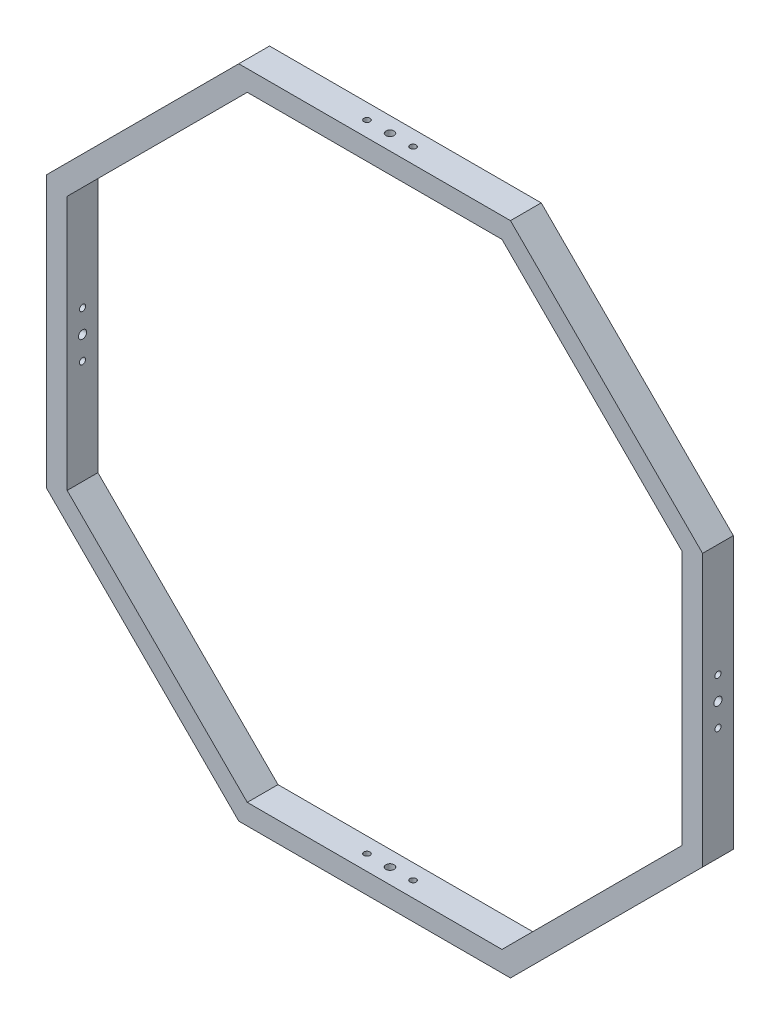
ISO-10303-21;
HEADER;
FILE_DESCRIPTION(('STEP AP214'),'2;1');
FILE_NAME('part.step','',(''),(''),'','','');
FILE_SCHEMA(('AUTOMOTIVE_DESIGN { 1 0 10303 214 1 1 1 1 }'));
ENDSEC;
DATA;
#1=APPLICATION_CONTEXT('core data for automotive mechanical design processes');
#2=APPLICATION_PROTOCOL_DEFINITION('international standard','automotive_design',2000,#1);
#3=PRODUCT_CONTEXT('',#1,'mechanical');
#4=PRODUCT('Part','Part','',(#3));
#5=PRODUCT_RELATED_PRODUCT_CATEGORY('part','',(#4));
#6=PRODUCT_DEFINITION_FORMATION('','',#4);
#7=PRODUCT_DEFINITION_CONTEXT('part definition',#1,'design');
#8=PRODUCT_DEFINITION('design','',#6,#7);
#9=PRODUCT_DEFINITION_SHAPE('','',#8);
#10=(LENGTH_UNIT() NAMED_UNIT(*) SI_UNIT(.MILLI.,.METRE.));
#11=(NAMED_UNIT(*) PLANE_ANGLE_UNIT() SI_UNIT($,.RADIAN.));
#12=(NAMED_UNIT(*) SI_UNIT($,.STERADIAN.) SOLID_ANGLE_UNIT());
#13=UNCERTAINTY_MEASURE_WITH_UNIT(LENGTH_MEASURE(1.E-05),#10,'distance_accuracy_value','');
#14=(GEOMETRIC_REPRESENTATION_CONTEXT(3) GLOBAL_UNCERTAINTY_ASSIGNED_CONTEXT((#13)) GLOBAL_UNIT_ASSIGNED_CONTEXT((#10,
#11,#12)) REPRESENTATION_CONTEXT('',''));
#15=CARTESIAN_POINT('',(0.,0.,0.));
#16=DIRECTION('',(0.,0.,1.));
#17=DIRECTION('',(1.,0.,0.));
#18=AXIS2_PLACEMENT_3D('',#15,#16,#17);
#19=CARTESIAN_POINT('',(0.,0.,60.));
#20=DIRECTION('',(0.,0.,1.));
#21=DIRECTION('',(1.,0.,0.));
#22=AXIS2_PLACEMENT_3D('',#19,#20,#21);
#23=PLANE('',#22);
#24=DIRECTION('',(-0.707106781186548,0.707106781186547,0.));
#25=VECTOR('',#24,1.);
#26=CARTESIAN_POINT('',(640.,265.096679918781,60.));
#27=LINE('',#26,#25);
#28=CARTESIAN_POINT('',(640.,265.096679918781,60.));
#29=VERTEX_POINT('',#28);
#30=CARTESIAN_POINT('',(265.09667991878,640.,60.));
#31=VERTEX_POINT('',#30);
#32=EDGE_CURVE('E220',#29,#31,#27,.T.);
#33=ORIENTED_EDGE('',*,*,#32,.T.);
#34=DIRECTION('',(-1.,0.,0.));
#35=VECTOR('',#34,1.);
#36=CARTESIAN_POINT('',(265.09667991878,640.,60.));
#37=LINE('',#36,#35);
#38=CARTESIAN_POINT('',(-265.096679918781,640.,60.));
#39=VERTEX_POINT('',#38);
#40=EDGE_CURVE('E223',#31,#39,#37,.T.);
#41=ORIENTED_EDGE('',*,*,#40,.T.);
#42=DIRECTION('',(-0.707106781186547,-0.707106781186548,0.));
#43=VECTOR('',#42,1.);
#44=CARTESIAN_POINT('',(-265.096679918781,640.,60.));
#45=LINE('',#44,#43);
#46=CARTESIAN_POINT('',(-640.,265.096679918781,60.));
#47=VERTEX_POINT('',#46);
#48=EDGE_CURVE('E226',#39,#47,#45,.T.);
#49=ORIENTED_EDGE('',*,*,#48,.T.);
#50=DIRECTION('',(0.,-1.,0.));
#51=VECTOR('',#50,1.);
#52=CARTESIAN_POINT('',(-640.,265.096679918781,60.));
#53=LINE('',#52,#51);
#54=CARTESIAN_POINT('',(-640.,-265.096679918781,60.));
#55=VERTEX_POINT('',#54);
#56=EDGE_CURVE('E228',#47,#55,#53,.T.);
#57=ORIENTED_EDGE('',*,*,#56,.T.);
#58=DIRECTION('',(0.707106781186548,-0.707106781186547,0.));
#59=VECTOR('',#58,1.);
#60=CARTESIAN_POINT('',(-640.,-265.096679918781,60.));
#61=LINE('',#60,#59);
#62=CARTESIAN_POINT('',(-265.096679918781,-640.,60.));
#63=VERTEX_POINT('',#62);
#64=EDGE_CURVE('E230',#55,#63,#61,.T.);
#65=ORIENTED_EDGE('',*,*,#64,.T.);
#66=DIRECTION('',(1.,0.,0.));
#67=VECTOR('',#66,1.);
#68=CARTESIAN_POINT('',(-265.096679918781,-640.,60.));
#69=LINE('',#68,#67);
#70=CARTESIAN_POINT('',(265.096679918781,-640.,60.));
#71=VERTEX_POINT('',#70);
#72=EDGE_CURVE('E232',#63,#71,#69,.T.);
#73=ORIENTED_EDGE('',*,*,#72,.T.);
#74=DIRECTION('',(0.707106781186547,0.707106781186548,0.));
#75=VECTOR('',#74,1.);
#76=CARTESIAN_POINT('',(265.096679918781,-640.,60.));
#77=LINE('',#76,#75);
#78=CARTESIAN_POINT('',(640.,-265.096679918781,60.));
#79=VERTEX_POINT('',#78);
#80=EDGE_CURVE('E234',#71,#79,#77,.T.);
#81=ORIENTED_EDGE('',*,*,#80,.T.);
#82=DIRECTION('',(0.,1.,0.));
#83=VECTOR('',#82,1.);
#84=CARTESIAN_POINT('',(640.,-265.096679918781,60.));
#85=LINE('',#84,#83);
#86=EDGE_CURVE('E236',#79,#29,#85,.T.);
#87=ORIENTED_EDGE('',*,*,#86,.T.);
#88=EDGE_LOOP('',(#33,#41,#49,#57,#65,#73,#81,#87));
#89=FACE_BOUND('',#88,.T.);
#90=DIRECTION('',(0.,1.,0.));
#91=VECTOR('',#90,1.);
#92=CARTESIAN_POINT('',(600.,-248.528137423857,60.));
#93=LINE('',#92,#91);
#94=CARTESIAN_POINT('',(600.,-248.528137423857,60.));
#95=VERTEX_POINT('',#94);
#96=CARTESIAN_POINT('',(600.,248.528137423857,60.));
#97=VERTEX_POINT('',#96);
#98=EDGE_CURVE('E161',#95,#97,#93,.T.);
#99=ORIENTED_EDGE('',*,*,#98,.F.);
#100=DIRECTION('',(0.707106781186547,0.707106781186548,0.));
#101=VECTOR('',#100,1.);
#102=CARTESIAN_POINT('',(248.528137423857,-600.,60.));
#103=LINE('',#102,#101);
#104=CARTESIAN_POINT('',(248.528137423857,-600.,60.));
#105=VERTEX_POINT('',#104);
#106=EDGE_CURVE('E153',#105,#95,#103,.T.);
#107=ORIENTED_EDGE('',*,*,#106,.F.);
#108=DIRECTION('',(1.,0.,0.));
#109=VECTOR('',#108,1.);
#110=CARTESIAN_POINT('',(-248.528137423857,-600.,60.));
#111=LINE('',#110,#109);
#112=CARTESIAN_POINT('',(-248.528137423857,-600.,60.));
#113=VERTEX_POINT('',#112);
#114=EDGE_CURVE('E187',#113,#105,#111,.T.);
#115=ORIENTED_EDGE('',*,*,#114,.F.);
#116=DIRECTION('',(0.707106781186548,-0.707106781186547,0.));
#117=VECTOR('',#116,1.);
#118=CARTESIAN_POINT('',(-600.,-248.528137423857,60.));
#119=LINE('',#118,#117);
#120=CARTESIAN_POINT('',(-600.,-248.528137423857,60.));
#121=VERTEX_POINT('',#120);
#122=EDGE_CURVE('E185',#121,#113,#119,.T.);
#123=ORIENTED_EDGE('',*,*,#122,.F.);
#124=DIRECTION('',(0.,-1.,0.));
#125=VECTOR('',#124,1.);
#126=CARTESIAN_POINT('',(-600.,248.528137423857,60.));
#127=LINE('',#126,#125);
#128=CARTESIAN_POINT('',(-600.,248.528137423857,60.));
#129=VERTEX_POINT('',#128);
#130=EDGE_CURVE('E183',#129,#121,#127,.T.);
#131=ORIENTED_EDGE('',*,*,#130,.F.);
#132=DIRECTION('',(-0.707106781186547,-0.707106781186548,0.));
#133=VECTOR('',#132,1.);
#134=CARTESIAN_POINT('',(-248.528137423857,600.,60.));
#135=LINE('',#134,#133);
#136=CARTESIAN_POINT('',(-248.528137423857,600.,60.));
#137=VERTEX_POINT('',#136);
#138=EDGE_CURVE('E181',#137,#129,#135,.T.);
#139=ORIENTED_EDGE('',*,*,#138,.F.);
#140=DIRECTION('',(-1.,0.,0.));
#141=VECTOR('',#140,1.);
#142=CARTESIAN_POINT('',(248.528137423856,600.,60.));
#143=LINE('',#142,#141);
#144=CARTESIAN_POINT('',(248.528137423856,600.,60.));
#145=VERTEX_POINT('',#144);
#146=EDGE_CURVE('E176',#145,#137,#143,.T.);
#147=ORIENTED_EDGE('',*,*,#146,.F.);
#148=DIRECTION('',(-0.707106781186548,0.707106781186547,0.));
#149=VECTOR('',#148,1.);
#150=CARTESIAN_POINT('',(600.,248.528137423857,60.));
#151=LINE('',#150,#149);
#152=EDGE_CURVE('E174',#97,#145,#151,.T.);
#153=ORIENTED_EDGE('',*,*,#152,.F.);
#154=EDGE_LOOP('',(#99,#107,#115,#123,#131,#139,#147,#153));
#155=FACE_BOUND('',#154,.T.);
#156=ADVANCED_FACE('F38',(#89,#155),#23,.T.);
#157=CARTESIAN_POINT('',(0.,0.,0.));
#158=DIRECTION('',(0.,0.,1.));
#159=DIRECTION('',(1.,0.,0.));
#160=AXIS2_PLACEMENT_3D('',#157,#158,#159);
#161=PLANE('',#160);
#162=DIRECTION('',(-0.707106781186548,0.707106781186547,0.));
#163=VECTOR('',#162,1.);
#164=CARTESIAN_POINT('',(640.,265.096679918781,0.));
#165=LINE('',#164,#163);
#166=CARTESIAN_POINT('',(640.,265.096679918781,0.));
#167=VERTEX_POINT('',#166);
#168=CARTESIAN_POINT('',(265.09667991878,640.,0.));
#169=VERTEX_POINT('',#168);
#170=EDGE_CURVE('E169',#167,#169,#165,.T.);
#171=ORIENTED_EDGE('',*,*,#170,.F.);
#172=DIRECTION('',(0.,1.,0.));
#173=VECTOR('',#172,1.);
#174=CARTESIAN_POINT('',(640.,-265.096679918781,0.));
#175=LINE('',#174,#173);
#176=CARTESIAN_POINT('',(640.,-265.096679918781,0.));
#177=VERTEX_POINT('',#176);
#178=EDGE_CURVE('E224',#177,#167,#175,.T.);
#179=ORIENTED_EDGE('',*,*,#178,.F.);
#180=DIRECTION('',(0.707106781186547,0.707106781186548,0.));
#181=VECTOR('',#180,1.);
#182=CARTESIAN_POINT('',(265.096679918781,-640.,0.));
#183=LINE('',#182,#181);
#184=CARTESIAN_POINT('',(265.096679918781,-640.,0.));
#185=VERTEX_POINT('',#184);
#186=EDGE_CURVE('E251',#185,#177,#183,.T.);
#187=ORIENTED_EDGE('',*,*,#186,.F.);
#188=DIRECTION('',(1.,0.,0.));
#189=VECTOR('',#188,1.);
#190=CARTESIAN_POINT('',(-265.096679918781,-640.,0.));
#191=LINE('',#190,#189);
#192=CARTESIAN_POINT('',(-265.096679918781,-640.,0.));
#193=VERTEX_POINT('',#192);
#194=EDGE_CURVE('E249',#193,#185,#191,.T.);
#195=ORIENTED_EDGE('',*,*,#194,.F.);
#196=DIRECTION('',(0.707106781186548,-0.707106781186547,0.));
#197=VECTOR('',#196,1.);
#198=CARTESIAN_POINT('',(-640.,-265.096679918781,0.));
#199=LINE('',#198,#197);
#200=CARTESIAN_POINT('',(-640.,-265.096679918781,0.));
#201=VERTEX_POINT('',#200);
#202=EDGE_CURVE('E247',#201,#193,#199,.T.);
#203=ORIENTED_EDGE('',*,*,#202,.F.);
#204=DIRECTION('',(0.,-1.,0.));
#205=VECTOR('',#204,1.);
#206=CARTESIAN_POINT('',(-640.,265.096679918781,0.));
#207=LINE('',#206,#205);
#208=CARTESIAN_POINT('',(-640.,265.096679918781,0.));
#209=VERTEX_POINT('',#208);
#210=EDGE_CURVE('E245',#209,#201,#207,.T.);
#211=ORIENTED_EDGE('',*,*,#210,.F.);
#212=DIRECTION('',(-0.707106781186547,-0.707106781186548,0.));
#213=VECTOR('',#212,1.);
#214=CARTESIAN_POINT('',(-265.096679918781,640.,0.));
#215=LINE('',#214,#213);
#216=CARTESIAN_POINT('',(-265.096679918781,640.,0.));
#217=VERTEX_POINT('',#216);
#218=EDGE_CURVE('E243',#217,#209,#215,.T.);
#219=ORIENTED_EDGE('',*,*,#218,.F.);
#220=DIRECTION('',(-1.,0.,0.));
#221=VECTOR('',#220,1.);
#222=CARTESIAN_POINT('',(265.09667991878,640.,0.));
#223=LINE('',#222,#221);
#224=EDGE_CURVE('E241',#169,#217,#223,.T.);
#225=ORIENTED_EDGE('',*,*,#224,.F.);
#226=EDGE_LOOP('',(#171,#179,#187,#195,#203,#211,#219,#225));
#227=FACE_BOUND('',#226,.T.);
#228=DIRECTION('',(0.707106781186547,0.707106781186548,0.));
#229=VECTOR('',#228,1.);
#230=CARTESIAN_POINT('',(248.528137423857,-600.,0.));
#231=LINE('',#230,#229);
#232=CARTESIAN_POINT('',(248.528137423857,-600.,0.));
#233=VERTEX_POINT('',#232);
#234=CARTESIAN_POINT('',(600.,-248.528137423857,0.));
#235=VERTEX_POINT('',#234);
#236=EDGE_CURVE('E63',#233,#235,#231,.T.);
#237=ORIENTED_EDGE('',*,*,#236,.T.);
#238=DIRECTION('',(0.,1.,0.));
#239=VECTOR('',#238,1.);
#240=CARTESIAN_POINT('',(600.,-248.528137423857,0.));
#241=LINE('',#240,#239);
#242=CARTESIAN_POINT('',(600.,248.528137423857,0.));
#243=VERTEX_POINT('',#242);
#244=EDGE_CURVE('E168',#235,#243,#241,.T.);
#245=ORIENTED_EDGE('',*,*,#244,.T.);
#246=DIRECTION('',(-0.707106781186548,0.707106781186547,0.));
#247=VECTOR('',#246,1.);
#248=CARTESIAN_POINT('',(600.,248.528137423857,0.));
#249=LINE('',#248,#247);
#250=CARTESIAN_POINT('',(248.528137423856,600.,0.));
#251=VERTEX_POINT('',#250);
#252=EDGE_CURVE('E192',#243,#251,#249,.T.);
#253=ORIENTED_EDGE('',*,*,#252,.T.);
#254=DIRECTION('',(-1.,0.,0.));
#255=VECTOR('',#254,1.);
#256=CARTESIAN_POINT('',(248.528137423856,600.,0.));
#257=LINE('',#256,#255);
#258=CARTESIAN_POINT('',(-248.528137423857,600.,0.));
#259=VERTEX_POINT('',#258);
#260=EDGE_CURVE('E195',#251,#259,#257,.T.);
#261=ORIENTED_EDGE('',*,*,#260,.T.);
#262=DIRECTION('',(-0.707106781186547,-0.707106781186548,0.));
#263=VECTOR('',#262,1.);
#264=CARTESIAN_POINT('',(-248.528137423857,600.,0.));
#265=LINE('',#264,#263);
#266=CARTESIAN_POINT('',(-600.,248.528137423857,0.));
#267=VERTEX_POINT('',#266);
#268=EDGE_CURVE('E198',#259,#267,#265,.T.);
#269=ORIENTED_EDGE('',*,*,#268,.T.);
#270=DIRECTION('',(0.,-1.,0.));
#271=VECTOR('',#270,1.);
#272=CARTESIAN_POINT('',(-600.,248.528137423857,0.));
#273=LINE('',#272,#271);
#274=CARTESIAN_POINT('',(-600.,-248.528137423857,0.));
#275=VERTEX_POINT('',#274);
#276=EDGE_CURVE('E201',#267,#275,#273,.T.);
#277=ORIENTED_EDGE('',*,*,#276,.T.);
#278=DIRECTION('',(0.707106781186548,-0.707106781186547,0.));
#279=VECTOR('',#278,1.);
#280=CARTESIAN_POINT('',(-600.,-248.528137423857,0.));
#281=LINE('',#280,#279);
#282=CARTESIAN_POINT('',(-248.528137423857,-600.,0.));
#283=VERTEX_POINT('',#282);
#284=EDGE_CURVE('E204',#275,#283,#281,.T.);
#285=ORIENTED_EDGE('',*,*,#284,.T.);
#286=DIRECTION('',(1.,0.,0.));
#287=VECTOR('',#286,1.);
#288=CARTESIAN_POINT('',(-248.528137423857,-600.,0.));
#289=LINE('',#288,#287);
#290=EDGE_CURVE('E162',#283,#233,#289,.T.);
#291=ORIENTED_EDGE('',*,*,#290,.T.);
#292=EDGE_LOOP('',(#237,#245,#253,#261,#269,#277,#285,#291));
#293=FACE_BOUND('',#292,.T.);
#294=ADVANCED_FACE('F361',(#227,#293),#161,.F.);
#295=CARTESIAN_POINT('',(640.,265.096679918781,60.));
#296=DIRECTION('',(-0.707106781186547,-0.707106781186548,0.));
#297=DIRECTION('',(0.707106781186548,-0.707106781186547,0.));
#298=AXIS2_PLACEMENT_3D('',#295,#296,#297);
#299=PLANE('',#298);
#300=ORIENTED_EDGE('',*,*,#170,.T.);
#301=DIRECTION('',(0.,0.,-1.));
#302=VECTOR('',#301,1.);
#303=CARTESIAN_POINT('',(265.09667991878,640.,60.));
#304=LINE('',#303,#302);
#305=EDGE_CURVE('E11',#31,#169,#304,.T.);
#306=ORIENTED_EDGE('',*,*,#305,.F.);
#307=ORIENTED_EDGE('',*,*,#32,.F.);
#308=DIRECTION('',(0.,0.,-1.));
#309=VECTOR('',#308,1.);
#310=CARTESIAN_POINT('',(640.,265.096679918781,60.));
#311=LINE('',#310,#309);
#312=EDGE_CURVE('E238',#29,#167,#311,.T.);
#313=ORIENTED_EDGE('',*,*,#312,.T.);
#314=EDGE_LOOP('',(#300,#306,#307,#313));
#315=FACE_BOUND('',#314,.T.);
#316=ADVANCED_FACE('F40',(#315),#299,.F.);
#317=CARTESIAN_POINT('',(265.09667991878,640.,60.));
#318=DIRECTION('',(0.,-1.,0.));
#319=DIRECTION('',(1.,0.,0.));
#320=AXIS2_PLACEMENT_3D('',#317,#318,#319);
#321=PLANE('',#320);
#322=CARTESIAN_POINT('',(45.0000000000001,640.,30.));
#323=DIRECTION('',(0.,-1.,0.));
#324=DIRECTION('',(1.,0.,0.));
#325=AXIS2_PLACEMENT_3D('',#322,#323,#324);
#326=CIRCLE('',#325,6.00000000000002);
#327=CARTESIAN_POINT('',(51.0000000000002,640.,30.));
#328=VERTEX_POINT('',#327);
#329=EDGE_CURVE('E314',#328,#328,#326,.T.);
#330=ORIENTED_EDGE('',*,*,#329,.T.);
#331=EDGE_LOOP('',(#330));
#332=FACE_BOUND('',#331,.T.);
#333=CARTESIAN_POINT('',(-44.9999999999999,640.,30.));
#334=DIRECTION('',(0.,-1.,0.));
#335=DIRECTION('',(1.,0.,0.));
#336=AXIS2_PLACEMENT_3D('',#333,#334,#335);
#337=CIRCLE('',#336,5.99999999999999);
#338=CARTESIAN_POINT('',(-38.9999999999999,640.,30.));
#339=VERTEX_POINT('',#338);
#340=EDGE_CURVE('E299',#339,#339,#337,.T.);
#341=ORIENTED_EDGE('',*,*,#340,.T.);
#342=EDGE_LOOP('',(#341));
#343=FACE_BOUND('',#342,.T.);
#344=CARTESIAN_POINT('',(1.38777878078145E-13,640.,30.));
#345=DIRECTION('',(0.,-1.,0.));
#346=DIRECTION('',(1.,0.,0.));
#347=AXIS2_PLACEMENT_3D('',#344,#345,#346);
#348=CIRCLE('',#347,8.);
#349=CARTESIAN_POINT('',(8.00000000000014,640.,30.));
#350=VERTEX_POINT('',#349);
#351=EDGE_CURVE('E295',#350,#350,#348,.T.);
#352=ORIENTED_EDGE('',*,*,#351,.T.);
#353=EDGE_LOOP('',(#352));
#354=FACE_BOUND('',#353,.T.);
#355=ORIENTED_EDGE('',*,*,#224,.T.);
#356=DIRECTION('',(0.,0.,-1.));
#357=VECTOR('',#356,1.);
#358=CARTESIAN_POINT('',(-265.096679918781,640.,60.));
#359=LINE('',#358,#357);
#360=EDGE_CURVE('E47',#39,#217,#359,.T.);
#361=ORIENTED_EDGE('',*,*,#360,.F.);
#362=ORIENTED_EDGE('',*,*,#40,.F.);
#363=ORIENTED_EDGE('',*,*,#305,.T.);
#364=EDGE_LOOP('',(#355,#361,#362,#363));
#365=FACE_BOUND('',#364,.T.);
#366=ADVANCED_FACE('F392',(#332,#343,#354,#365),#321,.F.);
#367=CARTESIAN_POINT('',(-265.096679918781,640.,60.));
#368=DIRECTION('',(0.707106781186548,-0.707106781186547,0.));
#369=DIRECTION('',(0.707106781186547,0.707106781186548,0.));
#370=AXIS2_PLACEMENT_3D('',#367,#368,#369);
#371=PLANE('',#370);
#372=ORIENTED_EDGE('',*,*,#218,.T.);
#373=DIRECTION('',(0.,0.,-1.));
#374=VECTOR('',#373,1.);
#375=CARTESIAN_POINT('',(-640.,265.096679918781,60.));
#376=LINE('',#375,#374);
#377=EDGE_CURVE('E268',#47,#209,#376,.T.);
#378=ORIENTED_EDGE('',*,*,#377,.F.);
#379=ORIENTED_EDGE('',*,*,#48,.F.);
#380=ORIENTED_EDGE('',*,*,#360,.T.);
#381=EDGE_LOOP('',(#372,#378,#379,#380));
#382=FACE_BOUND('',#381,.T.);
#383=ADVANCED_FACE('F390',(#382),#371,.F.);
#384=CARTESIAN_POINT('',(-640.,265.096679918781,60.));
#385=DIRECTION('',(1.,0.,0.));
#386=DIRECTION('',(0.,0.,-1.));
#387=AXIS2_PLACEMENT_3D('',#384,#385,#386);
#388=PLANE('',#387);
#389=CARTESIAN_POINT('',(-640.,-44.9999999999999,30.));
#390=DIRECTION('',(1.,0.,0.));
#391=DIRECTION('',(0.,0.,-1.));
#392=AXIS2_PLACEMENT_3D('',#389,#390,#391);
#393=CIRCLE('',#392,6.00000000000001);
#394=CARTESIAN_POINT('',(-640.,-44.9999999999999,24.));
#395=VERTEX_POINT('',#394);
#396=EDGE_CURVE('E190',#395,#395,#393,.T.);
#397=ORIENTED_EDGE('',*,*,#396,.T.);
#398=EDGE_LOOP('',(#397));
#399=FACE_BOUND('',#398,.T.);
#400=CARTESIAN_POINT('',(-640.,45.0000000000001,30.));
#401=DIRECTION('',(1.,0.,0.));
#402=DIRECTION('',(0.,0.,-1.));
#403=AXIS2_PLACEMENT_3D('',#400,#401,#402);
#404=CIRCLE('',#403,6.00000000000001);
#405=CARTESIAN_POINT('',(-640.,45.0000000000001,24.));
#406=VERTEX_POINT('',#405);
#407=EDGE_CURVE('E287',#406,#406,#404,.T.);
#408=ORIENTED_EDGE('',*,*,#407,.T.);
#409=EDGE_LOOP('',(#408));
#410=FACE_BOUND('',#409,.T.);
#411=CARTESIAN_POINT('',(-640.,1.34015774165447E-13,30.));
#412=DIRECTION('',(1.,0.,0.));
#413=DIRECTION('',(0.,0.,-1.));
#414=AXIS2_PLACEMENT_3D('',#411,#412,#413);
#415=CIRCLE('',#414,8.);
#416=CARTESIAN_POINT('',(-640.,1.34015774165447E-13,22.));
#417=VERTEX_POINT('',#416);
#418=EDGE_CURVE('E282',#417,#417,#415,.T.);
#419=ORIENTED_EDGE('',*,*,#418,.T.);
#420=EDGE_LOOP('',(#419));
#421=FACE_BOUND('',#420,.T.);
#422=ORIENTED_EDGE('',*,*,#210,.T.);
#423=DIRECTION('',(0.,0.,-1.));
#424=VECTOR('',#423,1.);
#425=CARTESIAN_POINT('',(-640.,-265.096679918781,60.));
#426=LINE('',#425,#424);
#427=EDGE_CURVE('E265',#55,#201,#426,.T.);
#428=ORIENTED_EDGE('',*,*,#427,.F.);
#429=ORIENTED_EDGE('',*,*,#56,.F.);
#430=ORIENTED_EDGE('',*,*,#377,.T.);
#431=EDGE_LOOP('',(#422,#428,#429,#430));
#432=FACE_BOUND('',#431,.T.);
#433=ADVANCED_FACE('F337',(#399,#410,#421,#432),#388,.F.);
#434=CARTESIAN_POINT('',(-640.,-265.096679918781,60.));
#435=DIRECTION('',(0.707106781186547,0.707106781186548,0.));
#436=DIRECTION('',(-0.707106781186548,0.707106781186547,0.));
#437=AXIS2_PLACEMENT_3D('',#434,#435,#436);
#438=PLANE('',#437);
#439=ORIENTED_EDGE('',*,*,#202,.T.);
#440=DIRECTION('',(0.,0.,-1.));
#441=VECTOR('',#440,1.);
#442=CARTESIAN_POINT('',(-265.096679918781,-640.,60.));
#443=LINE('',#442,#441);
#444=EDGE_CURVE('E262',#63,#193,#443,.T.);
#445=ORIENTED_EDGE('',*,*,#444,.F.);
#446=ORIENTED_EDGE('',*,*,#64,.F.);
#447=ORIENTED_EDGE('',*,*,#427,.T.);
#448=EDGE_LOOP('',(#439,#445,#446,#447));
#449=FACE_BOUND('',#448,.T.);
#450=ADVANCED_FACE('F383',(#449),#438,.F.);
#451=CARTESIAN_POINT('',(-265.096679918781,-640.,60.));
#452=DIRECTION('',(0.,1.,0.));
#453=DIRECTION('',(0.,0.,1.));
#454=AXIS2_PLACEMENT_3D('',#451,#452,#453);
#455=PLANE('',#454);
#456=CARTESIAN_POINT('',(45.0000000000001,-640.,30.));
#457=DIRECTION('',(0.,-1.,0.));
#458=DIRECTION('',(0.,0.,-1.));
#459=AXIS2_PLACEMENT_3D('',#456,#457,#458);
#460=CIRCLE('',#459,6.00000000000002);
#461=CARTESIAN_POINT('',(45.0000000000001,-640.,24.));
#462=VERTEX_POINT('',#461);
#463=EDGE_CURVE('E586',#462,#462,#460,.T.);
#464=ORIENTED_EDGE('',*,*,#463,.F.);
#465=EDGE_LOOP('',(#464));
#466=FACE_BOUND('',#465,.T.);
#467=CARTESIAN_POINT('',(-44.9999999999999,-640.,30.));
#468=DIRECTION('',(0.,-1.,0.));
#469=DIRECTION('',(0.,0.,-1.));
#470=AXIS2_PLACEMENT_3D('',#467,#468,#469);
#471=CIRCLE('',#470,5.99999999999999);
#472=CARTESIAN_POINT('',(-44.9999999999999,-640.,24.));
#473=VERTEX_POINT('',#472);
#474=EDGE_CURVE('E587',#473,#473,#471,.T.);
#475=ORIENTED_EDGE('',*,*,#474,.F.);
#476=EDGE_LOOP('',(#475));
#477=FACE_BOUND('',#476,.T.);
#478=CARTESIAN_POINT('',(1.38777878078145E-13,-640.,30.));
#479=DIRECTION('',(0.,-1.,0.));
#480=DIRECTION('',(0.,0.,-1.));
#481=AXIS2_PLACEMENT_3D('',#478,#479,#480);
#482=CIRCLE('',#481,8.);
#483=CARTESIAN_POINT('',(1.38777878078145E-13,-640.,22.));
#484=VERTEX_POINT('',#483);
#485=EDGE_CURVE('E291',#484,#484,#482,.T.);
#486=ORIENTED_EDGE('',*,*,#485,.F.);
#487=EDGE_LOOP('',(#486));
#488=FACE_BOUND('',#487,.T.);
#489=ORIENTED_EDGE('',*,*,#194,.T.);
#490=DIRECTION('',(0.,0.,-1.));
#491=VECTOR('',#490,1.);
#492=CARTESIAN_POINT('',(265.096679918781,-640.,60.));
#493=LINE('',#492,#491);
#494=EDGE_CURVE('E259',#71,#185,#493,.T.);
#495=ORIENTED_EDGE('',*,*,#494,.F.);
#496=ORIENTED_EDGE('',*,*,#72,.F.);
#497=ORIENTED_EDGE('',*,*,#444,.T.);
#498=EDGE_LOOP('',(#489,#495,#496,#497));
#499=FACE_BOUND('',#498,.T.);
#500=ADVANCED_FACE('F379',(#466,#477,#488,#499),#455,.F.);
#501=CARTESIAN_POINT('',(265.096679918781,-640.,60.));
#502=DIRECTION('',(-0.707106781186548,0.707106781186547,0.));
#503=DIRECTION('',(-0.707106781186547,-0.707106781186548,0.));
#504=AXIS2_PLACEMENT_3D('',#501,#502,#503);
#505=PLANE('',#504);
#506=ORIENTED_EDGE('',*,*,#186,.T.);
#507=DIRECTION('',(0.,0.,-1.));
#508=VECTOR('',#507,1.);
#509=CARTESIAN_POINT('',(640.,-265.096679918781,60.));
#510=LINE('',#509,#508);
#511=EDGE_CURVE('E256',#79,#177,#510,.T.);
#512=ORIENTED_EDGE('',*,*,#511,.F.);
#513=ORIENTED_EDGE('',*,*,#80,.F.);
#514=ORIENTED_EDGE('',*,*,#494,.T.);
#515=EDGE_LOOP('',(#506,#512,#513,#514));
#516=FACE_BOUND('',#515,.T.);
#517=ADVANCED_FACE('F375',(#516),#505,.F.);
#518=CARTESIAN_POINT('',(640.,-265.096679918781,60.));
#519=DIRECTION('',(-1.,0.,0.));
#520=DIRECTION('',(0.,-1.,0.));
#521=AXIS2_PLACEMENT_3D('',#518,#519,#520);
#522=PLANE('',#521);
#523=CARTESIAN_POINT('',(640.,-44.9999999999999,30.));
#524=DIRECTION('',(1.,0.,0.));
#525=DIRECTION('',(0.,0.,-1.));
#526=AXIS2_PLACEMENT_3D('',#523,#524,#525);
#527=CIRCLE('',#526,6.00000000000001);
#528=CARTESIAN_POINT('',(640.,-44.9999999999999,24.));
#529=VERTEX_POINT('',#528);
#530=EDGE_CURVE('E317',#529,#529,#527,.T.);
#531=ORIENTED_EDGE('',*,*,#530,.F.);
#532=EDGE_LOOP('',(#531));
#533=FACE_BOUND('',#532,.T.);
#534=CARTESIAN_POINT('',(640.,45.0000000000001,30.));
#535=DIRECTION('',(1.,0.,0.));
#536=DIRECTION('',(0.,0.,-1.));
#537=AXIS2_PLACEMENT_3D('',#534,#535,#536);
#538=CIRCLE('',#537,6.00000000000001);
#539=CARTESIAN_POINT('',(640.,45.0000000000001,24.));
#540=VERTEX_POINT('',#539);
#541=EDGE_CURVE('E318',#540,#540,#538,.T.);
#542=ORIENTED_EDGE('',*,*,#541,.F.);
#543=EDGE_LOOP('',(#542));
#544=FACE_BOUND('',#543,.T.);
#545=CARTESIAN_POINT('',(640.,1.34015774165447E-13,30.));
#546=DIRECTION('',(1.,0.,0.));
#547=DIRECTION('',(0.,0.,-1.));
#548=AXIS2_PLACEMENT_3D('',#545,#546,#547);
#549=CIRCLE('',#548,8.);
#550=CARTESIAN_POINT('',(640.,1.34015774165447E-13,22.));
#551=VERTEX_POINT('',#550);
#552=EDGE_CURVE('E277',#551,#551,#549,.T.);
#553=ORIENTED_EDGE('',*,*,#552,.F.);
#554=EDGE_LOOP('',(#553));
#555=FACE_BOUND('',#554,.T.);
#556=ORIENTED_EDGE('',*,*,#178,.T.);
#557=ORIENTED_EDGE('',*,*,#312,.F.);
#558=ORIENTED_EDGE('',*,*,#86,.F.);
#559=ORIENTED_EDGE('',*,*,#511,.T.);
#560=EDGE_LOOP('',(#556,#557,#558,#559));
#561=FACE_BOUND('',#560,.T.);
#562=ADVANCED_FACE('F372',(#533,#544,#555,#561),#522,.F.);
#563=CARTESIAN_POINT('',(248.528137423857,-600.,60.));
#564=DIRECTION('',(-0.707106781186548,0.707106781186547,0.));
#565=DIRECTION('',(-0.707106781186547,-0.707106781186548,0.));
#566=AXIS2_PLACEMENT_3D('',#563,#564,#565);
#567=PLANE('',#566);
#568=ORIENTED_EDGE('',*,*,#236,.F.);
#569=DIRECTION('',(0.,0.,-1.));
#570=VECTOR('',#569,1.);
#571=CARTESIAN_POINT('',(248.528137423857,-600.,60.));
#572=LINE('',#571,#570);
#573=EDGE_CURVE('E157',#105,#233,#572,.T.);
#574=ORIENTED_EDGE('',*,*,#573,.F.);
#575=ORIENTED_EDGE('',*,*,#106,.T.);
#576=DIRECTION('',(0.,0.,-1.));
#577=VECTOR('',#576,1.);
#578=CARTESIAN_POINT('',(600.,-248.528137423857,60.));
#579=LINE('',#578,#577);
#580=EDGE_CURVE('E156',#95,#235,#579,.T.);
#581=ORIENTED_EDGE('',*,*,#580,.T.);
#582=EDGE_LOOP('',(#568,#574,#575,#581));
#583=FACE_BOUND('',#582,.T.);
#584=ADVANCED_FACE('F155',(#583),#567,.T.);
#585=CARTESIAN_POINT('',(600.,-248.528137423857,60.));
#586=DIRECTION('',(-1.,0.,0.));
#587=DIRECTION('',(0.,-1.,0.));
#588=AXIS2_PLACEMENT_3D('',#585,#586,#587);
#589=PLANE('',#588);
#590=CARTESIAN_POINT('',(600.,-44.9999999999999,30.));
#591=DIRECTION('',(-1.,0.,0.));
#592=DIRECTION('',(0.,-1.,0.));
#593=AXIS2_PLACEMENT_3D('',#590,#591,#592);
#594=CIRCLE('',#593,6.00000000000001);
#595=CARTESIAN_POINT('',(600.,-50.9999999999999,30.));
#596=VERTEX_POINT('',#595);
#597=EDGE_CURVE('E286',#596,#596,#594,.T.);
#598=ORIENTED_EDGE('',*,*,#597,.F.);
#599=EDGE_LOOP('',(#598));
#600=FACE_BOUND('',#599,.T.);
#601=CARTESIAN_POINT('',(600.,45.0000000000001,30.));
#602=DIRECTION('',(-1.,0.,0.));
#603=DIRECTION('',(0.,-1.,0.));
#604=AXIS2_PLACEMENT_3D('',#601,#602,#603);
#605=CIRCLE('',#604,6.00000000000001);
#606=CARTESIAN_POINT('',(600.,39.0000000000001,30.));
#607=VERTEX_POINT('',#606);
#608=EDGE_CURVE('E281',#607,#607,#605,.T.);
#609=ORIENTED_EDGE('',*,*,#608,.F.);
#610=EDGE_LOOP('',(#609));
#611=FACE_BOUND('',#610,.T.);
#612=CARTESIAN_POINT('',(600.,1.34015774165447E-13,30.));
#613=DIRECTION('',(-1.,0.,0.));
#614=DIRECTION('',(0.,-1.,0.));
#615=AXIS2_PLACEMENT_3D('',#612,#613,#614);
#616=CIRCLE('',#615,8.);
#617=CARTESIAN_POINT('',(600.,-7.99999999999987,30.));
#618=VERTEX_POINT('',#617);
#619=EDGE_CURVE('E276',#618,#618,#616,.T.);
#620=ORIENTED_EDGE('',*,*,#619,.F.);
#621=EDGE_LOOP('',(#620));
#622=FACE_BOUND('',#621,.T.);
#623=ORIENTED_EDGE('',*,*,#244,.F.);
#624=ORIENTED_EDGE('',*,*,#580,.F.);
#625=ORIENTED_EDGE('',*,*,#98,.T.);
#626=DIRECTION('',(0.,0.,-1.));
#627=VECTOR('',#626,1.);
#628=CARTESIAN_POINT('',(600.,248.528137423857,60.));
#629=LINE('',#628,#627);
#630=EDGE_CURVE('E170',#97,#243,#629,.T.);
#631=ORIENTED_EDGE('',*,*,#630,.T.);
#632=EDGE_LOOP('',(#623,#624,#625,#631));
#633=FACE_BOUND('',#632,.T.);
#634=ADVANCED_FACE('F165',(#600,#611,#622,#633),#589,.T.);
#635=CARTESIAN_POINT('',(600.,248.528137423857,60.));
#636=DIRECTION('',(-0.707106781186547,-0.707106781186548,0.));
#637=DIRECTION('',(0.707106781186548,-0.707106781186547,0.));
#638=AXIS2_PLACEMENT_3D('',#635,#636,#637);
#639=PLANE('',#638);
#640=ORIENTED_EDGE('',*,*,#252,.F.);
#641=ORIENTED_EDGE('',*,*,#630,.F.);
#642=ORIENTED_EDGE('',*,*,#152,.T.);
#643=DIRECTION('',(0.,0.,-1.));
#644=VECTOR('',#643,1.);
#645=CARTESIAN_POINT('',(248.528137423856,600.,60.));
#646=LINE('',#645,#644);
#647=EDGE_CURVE('E217',#145,#251,#646,.T.);
#648=ORIENTED_EDGE('',*,*,#647,.T.);
#649=EDGE_LOOP('',(#640,#641,#642,#648));
#650=FACE_BOUND('',#649,.T.);
#651=ADVANCED_FACE('F452',(#650),#639,.T.);
#652=CARTESIAN_POINT('',(248.528137423856,600.,60.));
#653=DIRECTION('',(0.,-1.,0.));
#654=DIRECTION('',(1.,0.,0.));
#655=AXIS2_PLACEMENT_3D('',#652,#653,#654);
#656=PLANE('',#655);
#657=CARTESIAN_POINT('',(45.0000000000001,600.,30.));
#658=DIRECTION('',(0.,-1.,0.));
#659=DIRECTION('',(1.,0.,0.));
#660=AXIS2_PLACEMENT_3D('',#657,#658,#659);
#661=CIRCLE('',#660,6.00000000000002);
#662=CARTESIAN_POINT('',(51.0000000000002,600.,30.));
#663=VERTEX_POINT('',#662);
#664=EDGE_CURVE('E311',#663,#663,#661,.T.);
#665=ORIENTED_EDGE('',*,*,#664,.F.);
#666=EDGE_LOOP('',(#665));
#667=FACE_BOUND('',#666,.T.);
#668=CARTESIAN_POINT('',(-44.9999999999999,600.,30.));
#669=DIRECTION('',(0.,-1.,0.));
#670=DIRECTION('',(1.,0.,0.));
#671=AXIS2_PLACEMENT_3D('',#668,#669,#670);
#672=CIRCLE('',#671,5.99999999999999);
#673=CARTESIAN_POINT('',(-38.9999999999999,600.,30.));
#674=VERTEX_POINT('',#673);
#675=EDGE_CURVE('E294',#674,#674,#672,.T.);
#676=ORIENTED_EDGE('',*,*,#675,.F.);
#677=EDGE_LOOP('',(#676));
#678=FACE_BOUND('',#677,.T.);
#679=CARTESIAN_POINT('',(1.38777878078145E-13,600.,30.));
#680=DIRECTION('',(0.,-1.,0.));
#681=DIRECTION('',(1.,0.,0.));
#682=AXIS2_PLACEMENT_3D('',#679,#680,#681);
#683=CIRCLE('',#682,8.);
#684=CARTESIAN_POINT('',(8.00000000000014,600.,30.));
#685=VERTEX_POINT('',#684);
#686=EDGE_CURVE('E290',#685,#685,#683,.T.);
#687=ORIENTED_EDGE('',*,*,#686,.F.);
#688=EDGE_LOOP('',(#687));
#689=FACE_BOUND('',#688,.T.);
#690=ORIENTED_EDGE('',*,*,#260,.F.);
#691=ORIENTED_EDGE('',*,*,#647,.F.);
#692=ORIENTED_EDGE('',*,*,#146,.T.);
#693=DIRECTION('',(0.,0.,-1.));
#694=VECTOR('',#693,1.);
#695=CARTESIAN_POINT('',(-248.528137423857,600.,60.));
#696=LINE('',#695,#694);
#697=EDGE_CURVE('E215',#137,#259,#696,.T.);
#698=ORIENTED_EDGE('',*,*,#697,.T.);
#699=EDGE_LOOP('',(#690,#691,#692,#698));
#700=FACE_BOUND('',#699,.T.);
#701=ADVANCED_FACE('F449',(#667,#678,#689,#700),#656,.T.);
#702=CARTESIAN_POINT('',(-248.528137423857,600.,60.));
#703=DIRECTION('',(0.707106781186548,-0.707106781186547,0.));
#704=DIRECTION('',(0.707106781186547,0.707106781186548,0.));
#705=AXIS2_PLACEMENT_3D('',#702,#703,#704);
#706=PLANE('',#705);
#707=ORIENTED_EDGE('',*,*,#268,.F.);
#708=ORIENTED_EDGE('',*,*,#697,.F.);
#709=ORIENTED_EDGE('',*,*,#138,.T.);
#710=DIRECTION('',(0.,0.,-1.));
#711=VECTOR('',#710,1.);
#712=CARTESIAN_POINT('',(-600.,248.528137423857,60.));
#713=LINE('',#712,#711);
#714=EDGE_CURVE('E213',#129,#267,#713,.T.);
#715=ORIENTED_EDGE('',*,*,#714,.T.);
#716=EDGE_LOOP('',(#707,#708,#709,#715));
#717=FACE_BOUND('',#716,.T.);
#718=ADVANCED_FACE('F444',(#717),#706,.T.);
#719=CARTESIAN_POINT('',(-600.,248.528137423857,60.));
#720=DIRECTION('',(1.,0.,0.));
#721=DIRECTION('',(0.,0.,-1.));
#722=AXIS2_PLACEMENT_3D('',#719,#720,#721);
#723=PLANE('',#722);
#724=CARTESIAN_POINT('',(-600.,-44.9999999999999,30.));
#725=DIRECTION('',(1.,0.,0.));
#726=DIRECTION('',(0.,0.,-1.));
#727=AXIS2_PLACEMENT_3D('',#724,#725,#726);
#728=CIRCLE('',#727,6.00000000000001);
#729=CARTESIAN_POINT('',(-600.,-44.9999999999999,24.));
#730=VERTEX_POINT('',#729);
#731=EDGE_CURVE('E283',#730,#730,#728,.T.);
#732=ORIENTED_EDGE('',*,*,#731,.F.);
#733=EDGE_LOOP('',(#732));
#734=FACE_BOUND('',#733,.T.);
#735=CARTESIAN_POINT('',(-600.,45.0000000000001,30.));
#736=DIRECTION('',(1.,0.,0.));
#737=DIRECTION('',(0.,0.,-1.));
#738=AXIS2_PLACEMENT_3D('',#735,#736,#737);
#739=CIRCLE('',#738,6.00000000000001);
#740=CARTESIAN_POINT('',(-600.,45.0000000000001,24.));
#741=VERTEX_POINT('',#740);
#742=EDGE_CURVE('E278',#741,#741,#739,.T.);
#743=ORIENTED_EDGE('',*,*,#742,.F.);
#744=EDGE_LOOP('',(#743));
#745=FACE_BOUND('',#744,.T.);
#746=CARTESIAN_POINT('',(-600.,1.34015774165447E-13,30.));
#747=DIRECTION('',(1.,0.,0.));
#748=DIRECTION('',(0.,0.,-1.));
#749=AXIS2_PLACEMENT_3D('',#746,#747,#748);
#750=CIRCLE('',#749,8.);
#751=CARTESIAN_POINT('',(-600.,1.34015774165447E-13,22.));
#752=VERTEX_POINT('',#751);
#753=EDGE_CURVE('E273',#752,#752,#750,.T.);
#754=ORIENTED_EDGE('',*,*,#753,.F.);
#755=EDGE_LOOP('',(#754));
#756=FACE_BOUND('',#755,.T.);
#757=ORIENTED_EDGE('',*,*,#276,.F.);
#758=ORIENTED_EDGE('',*,*,#714,.F.);
#759=ORIENTED_EDGE('',*,*,#130,.T.);
#760=DIRECTION('',(0.,0.,-1.));
#761=VECTOR('',#760,1.);
#762=CARTESIAN_POINT('',(-600.,-248.528137423857,60.));
#763=LINE('',#762,#761);
#764=EDGE_CURVE('E211',#121,#275,#763,.T.);
#765=ORIENTED_EDGE('',*,*,#764,.T.);
#766=EDGE_LOOP('',(#757,#758,#759,#765));
#767=FACE_BOUND('',#766,.T.);
#768=ADVANCED_FACE('F440',(#734,#745,#756,#767),#723,.T.);
#769=CARTESIAN_POINT('',(-600.,-248.528137423857,60.));
#770=DIRECTION('',(0.707106781186547,0.707106781186548,0.));
#771=DIRECTION('',(-0.707106781186548,0.707106781186547,0.));
#772=AXIS2_PLACEMENT_3D('',#769,#770,#771);
#773=PLANE('',#772);
#774=ORIENTED_EDGE('',*,*,#284,.F.);
#775=ORIENTED_EDGE('',*,*,#764,.F.);
#776=ORIENTED_EDGE('',*,*,#122,.T.);
#777=DIRECTION('',(0.,0.,-1.));
#778=VECTOR('',#777,1.);
#779=CARTESIAN_POINT('',(-248.528137423857,-600.,60.));
#780=LINE('',#779,#778);
#781=EDGE_CURVE('E55',#113,#283,#780,.T.);
#782=ORIENTED_EDGE('',*,*,#781,.T.);
#783=EDGE_LOOP('',(#774,#775,#776,#782));
#784=FACE_BOUND('',#783,.T.);
#785=ADVANCED_FACE('F437',(#784),#773,.T.);
#786=CARTESIAN_POINT('',(-248.528137423857,-600.,60.));
#787=DIRECTION('',(0.,1.,0.));
#788=DIRECTION('',(0.,0.,1.));
#789=AXIS2_PLACEMENT_3D('',#786,#787,#788);
#790=PLANE('',#789);
#791=CARTESIAN_POINT('',(45.0000000000001,-600.,30.));
#792=DIRECTION('',(0.,1.,0.));
#793=DIRECTION('',(0.,0.,1.));
#794=AXIS2_PLACEMENT_3D('',#791,#792,#793);
#795=CIRCLE('',#794,6.00000000000002);
#796=CARTESIAN_POINT('',(45.0000000000001,-600.,36.));
#797=VERTEX_POINT('',#796);
#798=EDGE_CURVE('E42',#797,#797,#795,.T.);
#799=ORIENTED_EDGE('',*,*,#798,.F.);
#800=EDGE_LOOP('',(#799));
#801=FACE_BOUND('',#800,.T.);
#802=CARTESIAN_POINT('',(-44.9999999999999,-600.,30.));
#803=DIRECTION('',(0.,1.,0.));
#804=DIRECTION('',(0.,0.,1.));
#805=AXIS2_PLACEMENT_3D('',#802,#803,#804);
#806=CIRCLE('',#805,5.99999999999999);
#807=CARTESIAN_POINT('',(-44.9999999999999,-600.,36.));
#808=VERTEX_POINT('',#807);
#809=EDGE_CURVE('E292',#808,#808,#806,.T.);
#810=ORIENTED_EDGE('',*,*,#809,.F.);
#811=EDGE_LOOP('',(#810));
#812=FACE_BOUND('',#811,.T.);
#813=CARTESIAN_POINT('',(1.38777878078145E-13,-600.,30.));
#814=DIRECTION('',(0.,1.,0.));
#815=DIRECTION('',(0.,0.,1.));
#816=AXIS2_PLACEMENT_3D('',#813,#814,#815);
#817=CIRCLE('',#816,8.);
#818=CARTESIAN_POINT('',(1.38777878078145E-13,-600.,38.));
#819=VERTEX_POINT('',#818);
#820=EDGE_CURVE('E288',#819,#819,#817,.T.);
#821=ORIENTED_EDGE('',*,*,#820,.F.);
#822=EDGE_LOOP('',(#821));
#823=FACE_BOUND('',#822,.T.);
#824=ORIENTED_EDGE('',*,*,#290,.F.);
#825=ORIENTED_EDGE('',*,*,#781,.F.);
#826=ORIENTED_EDGE('',*,*,#114,.T.);
#827=ORIENTED_EDGE('',*,*,#573,.T.);
#828=EDGE_LOOP('',(#824,#825,#826,#827));
#829=FACE_BOUND('',#828,.T.);
#830=ADVANCED_FACE('F431',(#801,#812,#823,#829),#790,.T.);
#831=CARTESIAN_POINT('',(-1259.,1.34015774165447E-13,30.));
#832=DIRECTION('',(1.,0.,0.));
#833=DIRECTION('',(0.,0.,-1.));
#834=AXIS2_PLACEMENT_3D('',#831,#832,#833);
#835=CYLINDRICAL_SURFACE('',#834,8.);
#836=ORIENTED_EDGE('',*,*,#753,.T.);
#837=EDGE_LOOP('',(#836));
#838=FACE_BOUND('',#837,.T.);
#839=ORIENTED_EDGE('',*,*,#418,.F.);
#840=EDGE_LOOP('',(#839));
#841=FACE_BOUND('',#840,.T.);
#842=ADVANCED_FACE('F354',(#838,#841),#835,.F.);
#843=CARTESIAN_POINT('',(-1259.,45.0000000000001,30.));
#844=DIRECTION('',(1.,0.,0.));
#845=DIRECTION('',(0.,0.,-1.));
#846=AXIS2_PLACEMENT_3D('',#843,#844,#845);
#847=CYLINDRICAL_SURFACE('',#846,6.00000000000001);
#848=ORIENTED_EDGE('',*,*,#742,.T.);
#849=EDGE_LOOP('',(#848));
#850=FACE_BOUND('',#849,.T.);
#851=ORIENTED_EDGE('',*,*,#407,.F.);
#852=EDGE_LOOP('',(#851));
#853=FACE_BOUND('',#852,.T.);
#854=ADVANCED_FACE('F343',(#850,#853),#847,.F.);
#855=CARTESIAN_POINT('',(-1259.,-44.9999999999999,30.));
#856=DIRECTION('',(1.,0.,0.));
#857=DIRECTION('',(0.,0.,-1.));
#858=AXIS2_PLACEMENT_3D('',#855,#856,#857);
#859=CYLINDRICAL_SURFACE('',#858,6.00000000000001);
#860=ORIENTED_EDGE('',*,*,#731,.T.);
#861=EDGE_LOOP('',(#860));
#862=FACE_BOUND('',#861,.T.);
#863=ORIENTED_EDGE('',*,*,#396,.F.);
#864=EDGE_LOOP('',(#863));
#865=FACE_BOUND('',#864,.T.);
#866=ADVANCED_FACE('F340',(#862,#865),#859,.F.);
#867=ORIENTED_EDGE('',*,*,#619,.T.);
#868=EDGE_LOOP('',(#867));
#869=FACE_BOUND('',#868,.T.);
#870=ORIENTED_EDGE('',*,*,#552,.T.);
#871=EDGE_LOOP('',(#870));
#872=FACE_BOUND('',#871,.T.);
#873=ADVANCED_FACE('F342',(#869,#872),#835,.F.);
#874=ORIENTED_EDGE('',*,*,#608,.T.);
#875=EDGE_LOOP('',(#874));
#876=FACE_BOUND('',#875,.T.);
#877=ORIENTED_EDGE('',*,*,#541,.T.);
#878=EDGE_LOOP('',(#877));
#879=FACE_BOUND('',#878,.T.);
#880=ADVANCED_FACE('F351',(#876,#879),#847,.F.);
#881=ORIENTED_EDGE('',*,*,#597,.T.);
#882=EDGE_LOOP('',(#881));
#883=FACE_BOUND('',#882,.T.);
#884=ORIENTED_EDGE('',*,*,#530,.T.);
#885=EDGE_LOOP('',(#884));
#886=FACE_BOUND('',#885,.T.);
#887=ADVANCED_FACE('F346',(#883,#886),#859,.F.);
#888=CARTESIAN_POINT('',(1.38777878078145E-13,1259.,30.));
#889=DIRECTION('',(0.,-1.,0.));
#890=DIRECTION('',(0.,0.,-1.));
#891=AXIS2_PLACEMENT_3D('',#888,#889,#890);
#892=CYLINDRICAL_SURFACE('',#891,8.);
#893=ORIENTED_EDGE('',*,*,#820,.T.);
#894=EDGE_LOOP('',(#893));
#895=FACE_BOUND('',#894,.T.);
#896=ORIENTED_EDGE('',*,*,#485,.T.);
#897=EDGE_LOOP('',(#896));
#898=FACE_BOUND('',#897,.T.);
#899=ADVANCED_FACE('F358',(#895,#898),#892,.F.);
#900=CARTESIAN_POINT('',(-44.9999999999999,1259.,30.));
#901=DIRECTION('',(0.,-1.,0.));
#902=DIRECTION('',(0.,0.,-1.));
#903=AXIS2_PLACEMENT_3D('',#900,#901,#902);
#904=CYLINDRICAL_SURFACE('',#903,5.99999999999999);
#905=ORIENTED_EDGE('',*,*,#809,.T.);
#906=EDGE_LOOP('',(#905));
#907=FACE_BOUND('',#906,.T.);
#908=ORIENTED_EDGE('',*,*,#474,.T.);
#909=EDGE_LOOP('',(#908));
#910=FACE_BOUND('',#909,.T.);
#911=ADVANCED_FACE('F524',(#907,#910),#904,.F.);
#912=CARTESIAN_POINT('',(45.0000000000001,1259.,30.));
#913=DIRECTION('',(0.,-1.,0.));
#914=DIRECTION('',(0.,0.,-1.));
#915=AXIS2_PLACEMENT_3D('',#912,#913,#914);
#916=CYLINDRICAL_SURFACE('',#915,6.00000000000002);
#917=ORIENTED_EDGE('',*,*,#798,.T.);
#918=EDGE_LOOP('',(#917));
#919=FACE_BOUND('',#918,.T.);
#920=ORIENTED_EDGE('',*,*,#463,.T.);
#921=EDGE_LOOP('',(#920));
#922=FACE_BOUND('',#921,.T.);
#923=ADVANCED_FACE('F535',(#919,#922),#916,.F.);
#924=ORIENTED_EDGE('',*,*,#686,.T.);
#925=EDGE_LOOP('',(#924));
#926=FACE_BOUND('',#925,.T.);
#927=ORIENTED_EDGE('',*,*,#351,.F.);
#928=EDGE_LOOP('',(#927));
#929=FACE_BOUND('',#928,.T.);
#930=ADVANCED_FACE('F527',(#926,#929),#892,.F.);
#931=ORIENTED_EDGE('',*,*,#675,.T.);
#932=EDGE_LOOP('',(#931));
#933=FACE_BOUND('',#932,.T.);
#934=ORIENTED_EDGE('',*,*,#340,.F.);
#935=EDGE_LOOP('',(#934));
#936=FACE_BOUND('',#935,.T.);
#937=ADVANCED_FACE('F537',(#933,#936),#904,.F.);
#938=ORIENTED_EDGE('',*,*,#664,.T.);
#939=EDGE_LOOP('',(#938));
#940=FACE_BOUND('',#939,.T.);
#941=ORIENTED_EDGE('',*,*,#329,.F.);
#942=EDGE_LOOP('',(#941));
#943=FACE_BOUND('',#942,.T.);
#944=ADVANCED_FACE('F547',(#940,#943),#916,.F.);
#945=CLOSED_SHELL('',(#156,#294,#316,#366,#383,#433,#450,#500,#517,#562,#584,#634,#651,#701,
#718,#768,#785,#830,#842,#854,#866,#873,#880,#887,#899,#911,#923,#930,#937,#944));
#946=MANIFOLD_SOLID_BREP('B2',#945);
#947=ADVANCED_BREP_SHAPE_REPRESENTATION('',(#18,#946),#14);
#948=SHAPE_DEFINITION_REPRESENTATION(#9,#947);
ENDSEC;
END-ISO-10303-21;
